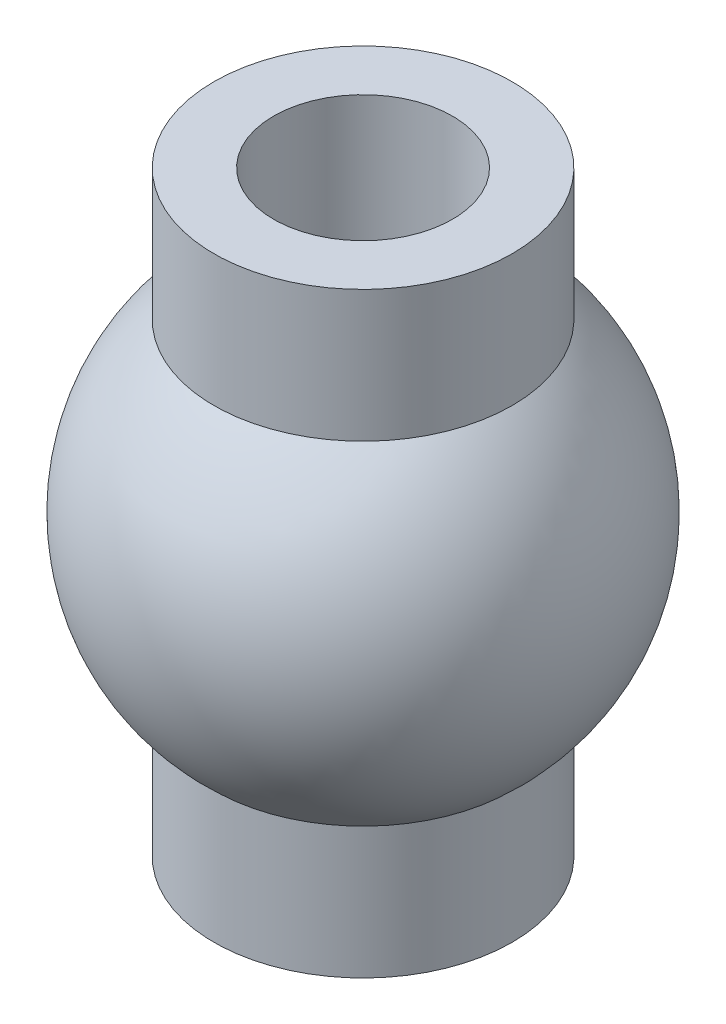
ISO-10303-21;
HEADER;
FILE_DESCRIPTION(('STEP AP214'),'2;1');
FILE_NAME('part.step','',(''),(''),'','','');
FILE_SCHEMA(('AUTOMOTIVE_DESIGN { 1 0 10303 214 1 1 1 1 }'));
ENDSEC;
DATA;
#1=APPLICATION_CONTEXT('core data for automotive mechanical design processes');
#2=APPLICATION_PROTOCOL_DEFINITION('international standard','automotive_design',2000,#1);
#3=PRODUCT_CONTEXT('',#1,'mechanical');
#4=PRODUCT('Part','Part','',(#3));
#5=PRODUCT_RELATED_PRODUCT_CATEGORY('part','',(#4));
#6=PRODUCT_DEFINITION_FORMATION('','',#4);
#7=PRODUCT_DEFINITION_CONTEXT('part definition',#1,'design');
#8=PRODUCT_DEFINITION('design','',#6,#7);
#9=PRODUCT_DEFINITION_SHAPE('','',#8);
#10=(LENGTH_UNIT() NAMED_UNIT(*) SI_UNIT(.MILLI.,.METRE.));
#11=(NAMED_UNIT(*) PLANE_ANGLE_UNIT() SI_UNIT($,.RADIAN.));
#12=(NAMED_UNIT(*) SI_UNIT($,.STERADIAN.) SOLID_ANGLE_UNIT());
#13=UNCERTAINTY_MEASURE_WITH_UNIT(LENGTH_MEASURE(1.E-05),#10,'distance_accuracy_value','');
#14=(GEOMETRIC_REPRESENTATION_CONTEXT(3) GLOBAL_UNCERTAINTY_ASSIGNED_CONTEXT((#13)) GLOBAL_UNIT_ASSIGNED_CONTEXT((#10,
#11,#12)) REPRESENTATION_CONTEXT('',''));
#15=CARTESIAN_POINT('',(0.,0.,0.));
#16=DIRECTION('',(0.,0.,1.));
#17=DIRECTION('',(1.,0.,0.));
#18=AXIS2_PLACEMENT_3D('',#15,#16,#17);
#19=CARTESIAN_POINT('',(5.,0.,0.));
#20=DIRECTION('',(0.,1.,0.));
#21=DIRECTION('',(-1.,0.,0.));
#22=AXIS2_PLACEMENT_3D('',#19,#20,#21);
#23=PLANE('',#22);
#24=CARTESIAN_POINT('',(0.,0.,0.));
#25=DIRECTION('',(0.,1.,0.));
#26=DIRECTION('',(-1.,0.,0.));
#27=AXIS2_PLACEMENT_3D('',#24,#25,#26);
#28=CIRCLE('',#27,3.);
#29=CARTESIAN_POINT('',(-3.,0.,0.));
#30=VERTEX_POINT('',#29);
#31=EDGE_CURVE('E51',#30,#30,#28,.T.);
#32=ORIENTED_EDGE('',*,*,#31,.T.);
#33=EDGE_LOOP('',(#32));
#34=FACE_BOUND('',#33,.T.);
#35=CARTESIAN_POINT('',(0.,0.,0.));
#36=DIRECTION('',(0.,1.,0.));
#37=DIRECTION('',(-1.,0.,0.));
#38=AXIS2_PLACEMENT_3D('',#35,#36,#37);
#39=CIRCLE('',#38,5.);
#40=CARTESIAN_POINT('',(-5.,0.,0.));
#41=VERTEX_POINT('',#40);
#42=EDGE_CURVE('E10',#41,#41,#39,.T.);
#43=ORIENTED_EDGE('',*,*,#42,.F.);
#44=EDGE_LOOP('',(#43));
#45=FACE_BOUND('',#44,.T.);
#46=ADVANCED_FACE('F32',(#34,#45),#23,.F.);
#47=CARTESIAN_POINT('',(0.,20.,0.));
#48=DIRECTION('',(0.,1.,0.));
#49=DIRECTION('',(-1.,0.,0.));
#50=AXIS2_PLACEMENT_3D('',#47,#48,#49);
#51=CYLINDRICAL_SURFACE('',#50,5.);
#52=CARTESIAN_POINT('',(0.,4.40983005625053,0.));
#53=DIRECTION('',(0.,1.,0.));
#54=DIRECTION('',(-1.,0.,0.));
#55=AXIS2_PLACEMENT_3D('',#52,#53,#54);
#56=CIRCLE('',#55,5.);
#57=CARTESIAN_POINT('',(5.,4.40983005625053,0.));
#58=VERTEX_POINT('',#57);
#59=EDGE_CURVE('E38',#58,#58,#56,.T.);
#60=ORIENTED_EDGE('',*,*,#59,.F.);
#61=EDGE_LOOP('',(#60));
#62=FACE_BOUND('',#61,.T.);
#63=ORIENTED_EDGE('',*,*,#42,.T.);
#64=EDGE_LOOP('',(#63));
#65=FACE_BOUND('',#64,.T.);
#66=ADVANCED_FACE('F80',(#62,#65),#51,.T.);
#67=CARTESIAN_POINT('',(0.,10.,0.));
#68=DIRECTION('',(0.,1.,0.));
#69=DIRECTION('',(1.,0.,0.));
#70=AXIS2_PLACEMENT_3D('',#67,#68,#69);
#71=SPHERICAL_SURFACE('',#70,7.5);
#72=CARTESIAN_POINT('',(0.,15.5901699437495,0.));
#73=DIRECTION('',(0.,1.,0.));
#74=DIRECTION('',(-1.,0.,0.));
#75=AXIS2_PLACEMENT_3D('',#72,#73,#74);
#76=CIRCLE('',#75,5.);
#77=CARTESIAN_POINT('',(5.,15.5901699437495,0.));
#78=VERTEX_POINT('',#77);
#79=EDGE_CURVE('E42',#78,#78,#76,.T.);
#80=CARTESIAN_POINT('',(5.,15.5901699437495,0.));
#81=CARTESIAN_POINT('',(5.09795484538906,15.5025610588143,0.));
#82=CARTESIAN_POINT('',(5.19360225256618,15.4123728474333,0.));
#83=CARTESIAN_POINT('',(5.38002855956408,15.227097602207,0.));
#84=CARTESIAN_POINT('',(5.47080745938486,15.1320105683617,0.));
#85=CARTESIAN_POINT('',(5.64724312073758,14.9371975086342,0.));
#86=CARTESIAN_POINT('',(5.73289988226953,14.837471482752,0.));
#87=CARTESIAN_POINT('',(5.89885539057948,14.6336567115313,0.));
#88=CARTESIAN_POINT('',(5.97915413735748,14.5295679661928,0.));
#89=CARTESIAN_POINT('',(6.13417157625531,14.3173151095536,0.));
#90=CARTESIAN_POINT('',(6.20889026837514,14.209150998253,0.));
#91=CARTESIAN_POINT('',(6.35254123243388,13.9890462822766,0.));
#92=CARTESIAN_POINT('',(6.4214735043728,13.8771056776008,0.));
#93=CARTESIAN_POINT('',(6.55336117896172,13.6497572107571,0.));
#94=CARTESIAN_POINT('',(6.61631658161171,13.5343493485891,0.));
#95=CARTESIAN_POINT('',(6.73607659897857,13.3003852000913,0.));
#96=CARTESIAN_POINT('',(6.79288121369543,13.1818289137614,0.));
#97=CARTESIAN_POINT('',(6.90018272393373,12.9418954431965,0.));
#98=CARTESIAN_POINT('',(6.95067961945516,12.8205182589615,0.));
#99=CARTESIAN_POINT('',(7.04522618727698,12.5752783132863,0.));
#100=CARTESIAN_POINT('',(7.08927585957737,12.4514155518462,0.));
#101=CARTESIAN_POINT('',(7.17080628787522,12.2015466388345,0.));
#102=CARTESIAN_POINT('',(7.20828704387267,12.0755404872631,0.));
#103=CARTESIAN_POINT('',(7.27657609407271,11.8217329025559,0.));
#104=CARTESIAN_POINT('',(7.30738438827531,11.6939314694202,0.));
#105=CARTESIAN_POINT('',(7.36224340292031,11.436886389827,0.));
#106=CARTESIAN_POINT('',(7.38629412336271,11.3076427433695,0.));
#107=CARTESIAN_POINT('',(7.42757154721411,11.0480702896856,0.));
#108=CARTESIAN_POINT('',(7.4447982506231,10.9177414824593,0.));
#109=CARTESIAN_POINT('',(7.4723800493761,10.6563587576883,0.));
#110=CARTESIAN_POINT('',(7.48273514472011,10.5253048401437,0.));
#111=CARTESIAN_POINT('',(7.49654512003206,10.2628339483993,0.));
#112=CARTESIAN_POINT('',(7.5,10.1314169741997,0.));
#113=CARTESIAN_POINT('',(7.5,9.86858302580034,0.));
#114=CARTESIAN_POINT('',(7.49654512003206,9.73716605160068,0.));
#115=CARTESIAN_POINT('',(7.48273514472011,9.47469515985634,0.));
#116=CARTESIAN_POINT('',(7.4723800493761,9.34364124231166,0.));
#117=CARTESIAN_POINT('',(7.4447982506231,9.08225851754068,0.));
#118=CARTESIAN_POINT('',(7.42757154721411,8.95192971031437,0.));
#119=CARTESIAN_POINT('',(7.38629412336271,8.69235725663053,0.));
#120=CARTESIAN_POINT('',(7.36224340292031,8.563113610173,0.));
#121=CARTESIAN_POINT('',(7.30738438827531,8.30606853057977,0.));
#122=CARTESIAN_POINT('',(7.27657609407271,8.17826709744408,0.));
#123=CARTESIAN_POINT('',(7.20828704387267,7.92445951273693,0.));
#124=CARTESIAN_POINT('',(7.17080628787522,7.79845336116547,0.));
#125=CARTESIAN_POINT('',(7.08927585957737,7.54858444815384,0.));
#126=CARTESIAN_POINT('',(7.04522618727698,7.42472168671366,0.));
#127=CARTESIAN_POINT('',(6.95067961945516,7.17948174103848,0.));
#128=CARTESIAN_POINT('',(6.90018272393372,7.05810455680347,0.));
#129=CARTESIAN_POINT('',(6.79288121369543,6.81817108623858,0.));
#130=CARTESIAN_POINT('',(6.73607659897857,6.69961479990869,0.));
#131=CARTESIAN_POINT('',(6.61631658161171,6.46565065141085,0.));
#132=CARTESIAN_POINT('',(6.55336117896171,6.3502427892429,0.));
#133=CARTESIAN_POINT('',(6.4214735043728,6.12289432239917,0.));
#134=CARTESIAN_POINT('',(6.35254123243388,6.01095371772339,0.));
#135=CARTESIAN_POINT('',(6.20889026837514,5.79084900174701,0.));
#136=CARTESIAN_POINT('',(6.13417157625531,5.68268489044641,0.));
#137=CARTESIAN_POINT('',(5.97915413735748,5.47043203380724,0.));
#138=CARTESIAN_POINT('',(5.89885539057948,5.36634328846868,0.));
#139=CARTESIAN_POINT('',(5.73289988226953,5.16252851724795,0.));
#140=CARTESIAN_POINT('',(5.64724312073758,5.0628024913658,0.));
#141=CARTESIAN_POINT('',(5.47080745938486,4.86798943163832,0.));
#142=CARTESIAN_POINT('',(5.38002855956408,4.772902397793,0.));
#143=CARTESIAN_POINT('',(5.19360225256618,4.58762715256667,0.));
#144=CARTESIAN_POINT('',(5.09795484538906,4.49743894118566,0.));
#145=CARTESIAN_POINT('',(5.,4.40983005625053,0.));
#146=B_SPLINE_CURVE_WITH_KNOTS('',3,(#80,#81,#82,#83,#84,#85,#86,#87,#88,#89,#90,#91,#92,#93,
#94,#95,#96,#97,#98,#99,#100,#101,#102,#103,#104,#105,#106,#107,#108,#109,#110,#111,#112,#113,
#114,#115,#116,#117,#118,#119,#120,#121,#122,#123,#124,#125,#126,#127,#128,#129,#130,#131,#132,
#133,#134,#135,#136,#137,#138,#139,#140,#141,#142,#143,#144,#145),.UNSPECIFIED.,.F.,.F.,(4,2,2,
2,2,2,2,2,2,2,2,2,2,2,2,2,2,2,2,2,2,2,2,2,2,2,2,2,2,2,2,2,4),(0.,0.394205548361106,
0.788411096722212,1.18261664508332,1.57682219344443,1.97102774180553,2.36523329016664,
2.75943883852774,3.15364438688885,3.54784993524996,3.94205548361107,4.33626103197217,
4.73046658033328,5.12467212869439,5.51887767705549,5.9130832254166,6.30728877377771,
6.70149432213881,7.09569987049992,7.48990541886103,7.88411096722213,8.27831651558324,
8.67252206394435,9.06672761230545,9.46093316066656,9.85513870902767,10.2493442573888,
10.6435498057499,11.037755354111,11.4319609024721,11.8261664508332,12.2203719991943,
12.6145775475554),.UNSPECIFIED.);
#147=EDGE_CURVE('BSEAM75',#78,#58,#146,.T.);
#148=ORIENTED_EDGE('',*,*,#79,.F.);
#149=ORIENTED_EDGE('',*,*,#59,.T.);
#150=ORIENTED_EDGE('',*,*,#147,.T.);
#151=ORIENTED_EDGE('',*,*,#147,.F.);
#152=EDGE_LOOP('',(#148,#150,#149,#151));
#153=FACE_BOUND('',#152,.T.);
#154=ADVANCED_FACE('F75',(#153),#71,.T.);
#155=CARTESIAN_POINT('',(0.,20.,0.));
#156=DIRECTION('',(0.,1.,0.));
#157=DIRECTION('',(-1.,0.,0.));
#158=AXIS2_PLACEMENT_3D('',#155,#156,#157);
#159=CYLINDRICAL_SURFACE('',#158,5.);
#160=CARTESIAN_POINT('',(0.,20.,0.));
#161=DIRECTION('',(0.,1.,0.));
#162=DIRECTION('',(-1.,0.,0.));
#163=AXIS2_PLACEMENT_3D('',#160,#161,#162);
#164=CIRCLE('',#163,5.);
#165=CARTESIAN_POINT('',(-5.,20.,0.));
#166=VERTEX_POINT('',#165);
#167=EDGE_CURVE('E46',#166,#166,#164,.T.);
#168=ORIENTED_EDGE('',*,*,#167,.F.);
#169=EDGE_LOOP('',(#168));
#170=FACE_BOUND('',#169,.T.);
#171=ORIENTED_EDGE('',*,*,#79,.T.);
#172=EDGE_LOOP('',(#171));
#173=FACE_BOUND('',#172,.T.);
#174=ADVANCED_FACE('F69',(#170,#173),#159,.T.);
#175=CARTESIAN_POINT('',(0.,20.,0.));
#176=DIRECTION('',(0.,-1.,0.));
#177=DIRECTION('',(1.,0.,0.));
#178=AXIS2_PLACEMENT_3D('',#175,#176,#177);
#179=PLANE('',#178);
#180=CARTESIAN_POINT('',(0.,20.,0.));
#181=DIRECTION('',(0.,1.,0.));
#182=DIRECTION('',(-1.,0.,0.));
#183=AXIS2_PLACEMENT_3D('',#180,#181,#182);
#184=CIRCLE('',#183,3.);
#185=CARTESIAN_POINT('',(-3.,20.,0.));
#186=VERTEX_POINT('',#185);
#187=EDGE_CURVE('E52',#186,#186,#184,.T.);
#188=ORIENTED_EDGE('',*,*,#187,.F.);
#189=EDGE_LOOP('',(#188));
#190=FACE_BOUND('',#189,.T.);
#191=ORIENTED_EDGE('',*,*,#167,.T.);
#192=EDGE_LOOP('',(#191));
#193=FACE_BOUND('',#192,.T.);
#194=ADVANCED_FACE('F63',(#190,#193),#179,.F.);
#195=CARTESIAN_POINT('',(0.,0.,0.));
#196=DIRECTION('',(0.,1.,0.));
#197=DIRECTION('',(-1.,0.,0.));
#198=AXIS2_PLACEMENT_3D('',#195,#196,#197);
#199=CYLINDRICAL_SURFACE('',#198,3.);
#200=ORIENTED_EDGE('',*,*,#31,.F.);
#201=EDGE_LOOP('',(#200));
#202=FACE_BOUND('',#201,.T.);
#203=ORIENTED_EDGE('',*,*,#187,.T.);
#204=EDGE_LOOP('',(#203));
#205=FACE_BOUND('',#204,.T.);
#206=ADVANCED_FACE('F60',(#202,#205),#199,.F.);
#207=CLOSED_SHELL('',(#46,#66,#154,#174,#194,#206));
#208=MANIFOLD_SOLID_BREP('B2',#207);
#209=ADVANCED_BREP_SHAPE_REPRESENTATION('',(#18,#208),#14);
#210=SHAPE_DEFINITION_REPRESENTATION(#9,#209);
ENDSEC;
END-ISO-10303-21;
